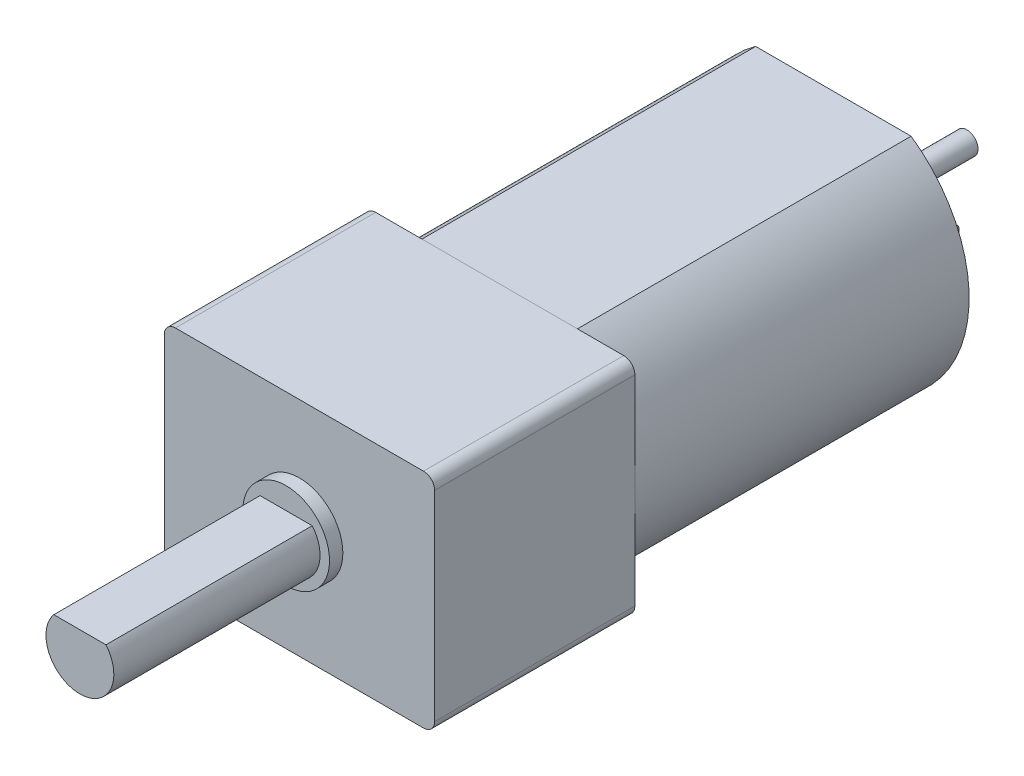
ISO-10303-21;
HEADER;
FILE_DESCRIPTION(('STEP AP214'),'2;1');
FILE_NAME('part.step','',(''),(''),'','','');
FILE_SCHEMA(('AUTOMOTIVE_DESIGN { 1 0 10303 214 1 1 1 1 }'));
ENDSEC;
DATA;
#1=APPLICATION_CONTEXT('core data for automotive mechanical design processes');
#2=APPLICATION_PROTOCOL_DEFINITION('international standard','automotive_design',2000,#1);
#3=PRODUCT_CONTEXT('',#1,'mechanical');
#4=PRODUCT('Part','Part','',(#3));
#5=PRODUCT_RELATED_PRODUCT_CATEGORY('part','',(#4));
#6=PRODUCT_DEFINITION_FORMATION('','',#4);
#7=PRODUCT_DEFINITION_CONTEXT('part definition',#1,'design');
#8=PRODUCT_DEFINITION('design','',#6,#7);
#9=PRODUCT_DEFINITION_SHAPE('','',#8);
#10=(LENGTH_UNIT() NAMED_UNIT(*) SI_UNIT(.MILLI.,.METRE.));
#11=(NAMED_UNIT(*) PLANE_ANGLE_UNIT() SI_UNIT($,.RADIAN.));
#12=(NAMED_UNIT(*) SI_UNIT($,.STERADIAN.) SOLID_ANGLE_UNIT());
#13=UNCERTAINTY_MEASURE_WITH_UNIT(LENGTH_MEASURE(1.E-05),#10,'distance_accuracy_value','');
#14=(GEOMETRIC_REPRESENTATION_CONTEXT(3) GLOBAL_UNCERTAINTY_ASSIGNED_CONTEXT((#13)) GLOBAL_UNIT_ASSIGNED_CONTEXT((#10,
#11,#12)) REPRESENTATION_CONTEXT('',''));
#15=CARTESIAN_POINT('',(0.,0.,0.));
#16=DIRECTION('',(0.,0.,1.));
#17=DIRECTION('',(1.,0.,0.));
#18=AXIS2_PLACEMENT_3D('',#15,#16,#17);
#19=CARTESIAN_POINT('',(0.,0.,-30.));
#20=DIRECTION('',(0.,0.,1.));
#21=DIRECTION('',(1.,0.,0.));
#22=AXIS2_PLACEMENT_3D('',#19,#20,#21);
#23=CYLINDRICAL_SURFACE('',#22,0.5);
#24=CARTESIAN_POINT('',(0.,0.,-30.));
#25=DIRECTION('',(0.,0.,-1.));
#26=DIRECTION('',(-1.,0.,0.));
#27=AXIS2_PLACEMENT_3D('',#24,#25,#26);
#28=CIRCLE('',#27,0.5);
#29=CARTESIAN_POINT('',(-0.5,0.,-30.));
#30=VERTEX_POINT('',#29);
#31=EDGE_CURVE('E11',#30,#30,#28,.T.);
#32=ORIENTED_EDGE('',*,*,#31,.F.);
#33=EDGE_LOOP('',(#32));
#34=FACE_BOUND('',#33,.T.);
#35=CARTESIAN_POINT('',(0.,0.,-25.5));
#36=DIRECTION('',(0.,0.,-1.));
#37=DIRECTION('',(-1.,0.,0.));
#38=AXIS2_PLACEMENT_3D('',#35,#36,#37);
#39=CIRCLE('',#38,0.5);
#40=CARTESIAN_POINT('',(-0.5,0.,-25.5));
#41=VERTEX_POINT('',#40);
#42=EDGE_CURVE('E44',#41,#41,#39,.T.);
#43=ORIENTED_EDGE('',*,*,#42,.T.);
#44=EDGE_LOOP('',(#43));
#45=FACE_BOUND('',#44,.T.);
#46=ADVANCED_FACE('F41',(#34,#45),#23,.T.);
#47=CARTESIAN_POINT('',(0.,0.,-30.));
#48=DIRECTION('',(0.,0.,-1.));
#49=DIRECTION('',(-1.,0.,0.));
#50=AXIS2_PLACEMENT_3D('',#47,#48,#49);
#51=PLANE('',#50);
#52=ORIENTED_EDGE('',*,*,#31,.T.);
#53=EDGE_LOOP('',(#52));
#54=FACE_BOUND('',#53,.T.);
#55=ADVANCED_FACE('F56',(#54),#51,.T.);
#56=CARTESIAN_POINT('',(0.,0.,-25.5));
#57=DIRECTION('',(0.,0.,-1.));
#58=DIRECTION('',(-1.,0.,0.));
#59=AXIS2_PLACEMENT_3D('',#56,#57,#58);
#60=PLANE('',#59);
#61=ORIENTED_EDGE('',*,*,#42,.F.);
#62=EDGE_LOOP('',(#61));
#63=FACE_BOUND('',#62,.T.);
#64=ADVANCED_FACE('F54',(#63),#60,.F.);
#65=CLOSED_SHELL('',(#46,#55,#64));
#66=MANIFOLD_SOLID_BREP('B2',#65);
#67=CARTESIAN_POINT('',(0.,0.,-25.5));
#68=DIRECTION('',(0.,0.,1.));
#69=DIRECTION('',(1.,0.,0.));
#70=AXIS2_PLACEMENT_3D('',#67,#68,#69);
#71=CYLINDRICAL_SURFACE('',#70,2.5);
#72=CARTESIAN_POINT('',(0.,0.,-25.2));
#73=DIRECTION('',(0.,0.,-1.));
#74=DIRECTION('',(-1.,0.,0.));
#75=AXIS2_PLACEMENT_3D('',#72,#73,#74);
#76=CIRCLE('',#75,2.5);
#77=CARTESIAN_POINT('',(-2.5,0.,-25.2));
#78=VERTEX_POINT('',#77);
#79=EDGE_CURVE('E40',#78,#78,#76,.F.);
#80=ORIENTED_EDGE('',*,*,#79,.T.);
#81=EDGE_LOOP('',(#80));
#82=FACE_BOUND('',#81,.T.);
#83=CARTESIAN_POINT('',(0.,0.,-24.));
#84=DIRECTION('',(0.,0.,-1.));
#85=DIRECTION('',(-1.,0.,0.));
#86=AXIS2_PLACEMENT_3D('',#83,#84,#85);
#87=CIRCLE('',#86,2.5);
#88=CARTESIAN_POINT('',(-2.5,0.,-24.));
#89=VERTEX_POINT('',#88);
#90=EDGE_CURVE('E102',#89,#89,#87,.T.);
#91=ORIENTED_EDGE('',*,*,#90,.T.);
#92=EDGE_LOOP('',(#91));
#93=FACE_BOUND('',#92,.T.);
#94=ADVANCED_FACE('F91',(#82,#93),#71,.T.);
#95=CARTESIAN_POINT('',(0.,0.,-25.5));
#96=DIRECTION('',(0.,0.,-1.));
#97=DIRECTION('',(-1.,0.,0.));
#98=AXIS2_PLACEMENT_3D('',#95,#96,#97);
#99=PLANE('',#98);
#100=CARTESIAN_POINT('',(0.,0.,-25.5));
#101=DIRECTION('',(0.,0.,-1.));
#102=DIRECTION('',(-1.,0.,0.));
#103=AXIS2_PLACEMENT_3D('',#100,#101,#102);
#104=CIRCLE('',#103,2.2);
#105=CARTESIAN_POINT('',(-2.2,0.,-25.5));
#106=VERTEX_POINT('',#105);
#107=EDGE_CURVE('E98',#106,#106,#104,.T.);
#108=ORIENTED_EDGE('',*,*,#107,.T.);
#109=EDGE_LOOP('',(#108));
#110=FACE_BOUND('',#109,.T.);
#111=ADVANCED_FACE('F112',(#110),#99,.T.);
#112=CARTESIAN_POINT('',(0.,0.,-24.));
#113=DIRECTION('',(0.,0.,-1.));
#114=DIRECTION('',(-1.,0.,0.));
#115=AXIS2_PLACEMENT_3D('',#112,#113,#114);
#116=PLANE('',#115);
#117=ORIENTED_EDGE('',*,*,#90,.F.);
#118=EDGE_LOOP('',(#117));
#119=FACE_BOUND('',#118,.T.);
#120=ADVANCED_FACE('F110',(#119),#116,.F.);
#121=CARTESIAN_POINT('',(0.,0.,-25.2));
#122=DIRECTION('',(0.,0.,-1.));
#123=DIRECTION('',(-1.,0.,0.));
#124=AXIS2_PLACEMENT_3D('',#121,#122,#123);
#125=TOROIDAL_SURFACE('',#124,2.2,0.3);
#126=ORIENTED_EDGE('',*,*,#79,.F.);
#127=EDGE_LOOP('',(#126));
#128=FACE_BOUND('',#127,.T.);
#129=ORIENTED_EDGE('',*,*,#107,.F.);
#130=EDGE_LOOP('',(#129));
#131=FACE_BOUND('',#130,.T.);
#132=ADVANCED_FACE('F93',(#128,#131),#125,.T.);
#133=CLOSED_SHELL('',(#94,#111,#120,#132));
#134=MANIFOLD_SOLID_BREP('B6',#133);
#135=CARTESIAN_POINT('',(0.,0.,-24.));
#136=DIRECTION('',(0.,0.,-1.));
#137=DIRECTION('',(-1.,0.,0.));
#138=AXIS2_PLACEMENT_3D('',#135,#136,#137);
#139=PLANE('',#138);
#140=DIRECTION('',(0.,-1.,0.));
#141=VECTOR('',#140,1.);
#142=CARTESIAN_POINT('',(3.35,0.75,-24.));
#143=LINE('',#142,#141);
#144=CARTESIAN_POINT('',(3.35,0.75,-24.));
#145=VERTEX_POINT('',#144);
#146=CARTESIAN_POINT('',(3.35,-0.75,-24.));
#147=VERTEX_POINT('',#146);
#148=EDGE_CURVE('E274',#145,#147,#143,.T.);
#149=ORIENTED_EDGE('',*,*,#148,.T.);
#150=DIRECTION('',(1.,0.,0.));
#151=VECTOR('',#150,1.);
#152=CARTESIAN_POINT('',(3.35,-0.75,-24.));
#153=LINE('',#152,#151);
#154=CARTESIAN_POINT('',(3.65,-0.75,-24.));
#155=VERTEX_POINT('',#154);
#156=EDGE_CURVE('E288',#147,#155,#153,.T.);
#157=ORIENTED_EDGE('',*,*,#156,.T.);
#158=DIRECTION('',(0.,1.,0.));
#159=VECTOR('',#158,1.);
#160=CARTESIAN_POINT('',(3.65,0.75,-24.));
#161=LINE('',#160,#159);
#162=CARTESIAN_POINT('',(3.65,0.75,-24.));
#163=VERTEX_POINT('',#162);
#164=EDGE_CURVE('E296',#155,#163,#161,.T.);
#165=ORIENTED_EDGE('',*,*,#164,.T.);
#166=DIRECTION('',(-1.,0.,0.));
#167=VECTOR('',#166,1.);
#168=CARTESIAN_POINT('',(3.35,0.75,-24.));
#169=LINE('',#168,#167);
#170=EDGE_CURVE('E291',#163,#145,#169,.T.);
#171=ORIENTED_EDGE('',*,*,#170,.T.);
#172=EDGE_LOOP('',(#149,#157,#165,#171));
#173=FACE_BOUND('',#172,.T.);
#174=CARTESIAN_POINT('',(0.,0.,-24.));
#175=DIRECTION('',(0.,0.,-1.));
#176=DIRECTION('',(-1.,0.,0.));
#177=AXIS2_PLACEMENT_3D('',#174,#175,#176);
#178=CIRCLE('',#177,6.10000000000001);
#179=CARTESIAN_POINT('',(-3.49428104193124,-5.,-24.));
#180=VERTEX_POINT('',#179);
#181=CARTESIAN_POINT('',(-3.49428104193124,5.,-24.));
#182=VERTEX_POINT('',#181);
#183=EDGE_CURVE('E334',#180,#182,#178,.T.);
#184=ORIENTED_EDGE('',*,*,#183,.T.);
#185=DIRECTION('',(1.,0.,0.));
#186=VECTOR('',#185,1.);
#187=CARTESIAN_POINT('',(3.49428104193124,5.,-24.));
#188=LINE('',#187,#186);
#189=CARTESIAN_POINT('',(3.49428104193124,5.,-24.));
#190=VERTEX_POINT('',#189);
#191=EDGE_CURVE('E337',#182,#190,#188,.T.);
#192=ORIENTED_EDGE('',*,*,#191,.T.);
#193=CARTESIAN_POINT('',(0.,0.,-24.));
#194=DIRECTION('',(0.,0.,-1.));
#195=DIRECTION('',(-1.,0.,0.));
#196=AXIS2_PLACEMENT_3D('',#193,#194,#195);
#197=CIRCLE('',#196,6.10000000000001);
#198=CARTESIAN_POINT('',(3.49428104193125,-5.,-24.));
#199=VERTEX_POINT('',#198);
#200=EDGE_CURVE('E340',#190,#199,#197,.T.);
#201=ORIENTED_EDGE('',*,*,#200,.T.);
#202=DIRECTION('',(-1.,0.,0.));
#203=VECTOR('',#202,1.);
#204=CARTESIAN_POINT('',(3.49428104193124,-5.,-24.));
#205=LINE('',#204,#203);
#206=EDGE_CURVE('E342',#199,#180,#205,.T.);
#207=ORIENTED_EDGE('',*,*,#206,.T.);
#208=EDGE_LOOP('',(#184,#192,#201,#207));
#209=FACE_BOUND('',#208,.T.);
#210=DIRECTION('',(-1.,0.,0.));
#211=VECTOR('',#210,1.);
#212=CARTESIAN_POINT('',(-3.35,-0.75,-24.));
#213=LINE('',#212,#211);
#214=CARTESIAN_POINT('',(-3.35,-0.75,-24.));
#215=VERTEX_POINT('',#214);
#216=CARTESIAN_POINT('',(-3.65,-0.75,-24.));
#217=VERTEX_POINT('',#216);
#218=EDGE_CURVE('E318',#215,#217,#213,.T.);
#219=ORIENTED_EDGE('',*,*,#218,.F.);
#220=DIRECTION('',(0.,-1.,0.));
#221=VECTOR('',#220,1.);
#222=CARTESIAN_POINT('',(-3.35,0.75,-24.));
#223=LINE('',#222,#221);
#224=CARTESIAN_POINT('',(-3.35,0.75,-24.));
#225=VERTEX_POINT('',#224);
#226=EDGE_CURVE('E307',#225,#215,#223,.T.);
#227=ORIENTED_EDGE('',*,*,#226,.F.);
#228=DIRECTION('',(1.,0.,0.));
#229=VECTOR('',#228,1.);
#230=CARTESIAN_POINT('',(-3.35,0.75,-24.));
#231=LINE('',#230,#229);
#232=CARTESIAN_POINT('',(-3.65,0.75,-24.));
#233=VERTEX_POINT('',#232);
#234=EDGE_CURVE('E312',#233,#225,#231,.T.);
#235=ORIENTED_EDGE('',*,*,#234,.F.);
#236=DIRECTION('',(0.,1.,0.));
#237=VECTOR('',#236,1.);
#238=CARTESIAN_POINT('',(-3.65,0.75,-24.));
#239=LINE('',#238,#237);
#240=EDGE_CURVE('E321',#217,#233,#239,.T.);
#241=ORIENTED_EDGE('',*,*,#240,.F.);
#242=EDGE_LOOP('',(#219,#227,#235,#241));
#243=FACE_BOUND('',#242,.T.);
#244=ADVANCED_FACE('F155',(#173,#209,#243),#139,.T.);
#245=CARTESIAN_POINT('',(0.,0.,-24.));
#246=DIRECTION('',(0.,0.,1.));
#247=DIRECTION('',(1.,0.,0.));
#248=AXIS2_PLACEMENT_3D('',#245,#246,#247);
#249=CYLINDRICAL_SURFACE('',#248,6.10000000000001);
#250=CARTESIAN_POINT('',(0.,0.,-9.));
#251=DIRECTION('',(0.,0.,-1.));
#252=DIRECTION('',(-1.,0.,0.));
#253=AXIS2_PLACEMENT_3D('',#250,#251,#252);
#254=CIRCLE('',#253,6.10000000000001);
#255=CARTESIAN_POINT('',(-3.49428104193124,-5.,-9.));
#256=VERTEX_POINT('',#255);
#257=CARTESIAN_POINT('',(-3.49428104193124,5.,-9.));
#258=VERTEX_POINT('',#257);
#259=EDGE_CURVE('E333',#256,#258,#254,.T.);
#260=ORIENTED_EDGE('',*,*,#259,.T.);
#261=DIRECTION('',(0.,0.,1.));
#262=VECTOR('',#261,1.);
#263=CARTESIAN_POINT('',(-3.49428104193124,5.,-24.));
#264=LINE('',#263,#262);
#265=EDGE_CURVE('E360',#182,#258,#264,.T.);
#266=ORIENTED_EDGE('',*,*,#265,.F.);
#267=ORIENTED_EDGE('',*,*,#183,.F.);
#268=DIRECTION('',(0.,0.,1.));
#269=VECTOR('',#268,1.);
#270=CARTESIAN_POINT('',(-3.49428104193124,-5.,-24.));
#271=LINE('',#270,#269);
#272=EDGE_CURVE('E344',#180,#256,#271,.T.);
#273=ORIENTED_EDGE('',*,*,#272,.T.);
#274=EDGE_LOOP('',(#260,#266,#267,#273));
#275=FACE_BOUND('',#274,.T.);
#276=ADVANCED_FACE('F409',(#275),#249,.T.);
#277=CARTESIAN_POINT('',(3.49428104193124,5.,-24.));
#278=DIRECTION('',(0.,-1.,0.));
#279=DIRECTION('',(0.,0.,-1.));
#280=AXIS2_PLACEMENT_3D('',#277,#278,#279);
#281=PLANE('',#280);
#282=DIRECTION('',(1.,0.,0.));
#283=VECTOR('',#282,1.);
#284=CARTESIAN_POINT('',(3.49428104193124,5.,-9.));
#285=LINE('',#284,#283);
#286=CARTESIAN_POINT('',(3.49428104193124,5.,-9.));
#287=VERTEX_POINT('',#286);
#288=EDGE_CURVE('E347',#258,#287,#285,.T.);
#289=ORIENTED_EDGE('',*,*,#288,.T.);
#290=DIRECTION('',(0.,0.,1.));
#291=VECTOR('',#290,1.);
#292=CARTESIAN_POINT('',(3.49428104193124,5.,-24.));
#293=LINE('',#292,#291);
#294=EDGE_CURVE('E357',#190,#287,#293,.T.);
#295=ORIENTED_EDGE('',*,*,#294,.F.);
#296=ORIENTED_EDGE('',*,*,#191,.F.);
#297=ORIENTED_EDGE('',*,*,#265,.T.);
#298=EDGE_LOOP('',(#289,#295,#296,#297));
#299=FACE_BOUND('',#298,.T.);
#300=ADVANCED_FACE('F414',(#299),#281,.F.);
#301=CARTESIAN_POINT('',(0.,0.,-24.));
#302=DIRECTION('',(0.,0.,1.));
#303=DIRECTION('',(1.,0.,0.));
#304=AXIS2_PLACEMENT_3D('',#301,#302,#303);
#305=CYLINDRICAL_SURFACE('',#304,6.10000000000001);
#306=CARTESIAN_POINT('',(0.,0.,-9.));
#307=DIRECTION('',(0.,0.,-1.));
#308=DIRECTION('',(-1.,0.,0.));
#309=AXIS2_PLACEMENT_3D('',#306,#307,#308);
#310=CIRCLE('',#309,6.10000000000001);
#311=CARTESIAN_POINT('',(3.49428104193125,-5.,-9.));
#312=VERTEX_POINT('',#311);
#313=EDGE_CURVE('E349',#287,#312,#310,.T.);
#314=ORIENTED_EDGE('',*,*,#313,.T.);
#315=DIRECTION('',(0.,0.,1.));
#316=VECTOR('',#315,1.);
#317=CARTESIAN_POINT('',(3.49428104193125,-5.,-24.));
#318=LINE('',#317,#316);
#319=EDGE_CURVE('E354',#199,#312,#318,.T.);
#320=ORIENTED_EDGE('',*,*,#319,.F.);
#321=ORIENTED_EDGE('',*,*,#200,.F.);
#322=ORIENTED_EDGE('',*,*,#294,.T.);
#323=EDGE_LOOP('',(#314,#320,#321,#322));
#324=FACE_BOUND('',#323,.T.);
#325=ADVANCED_FACE('F428',(#324),#305,.T.);
#326=CARTESIAN_POINT('',(3.49428104193124,-5.,-24.));
#327=DIRECTION('',(0.,1.,0.));
#328=DIRECTION('',(0.,0.,1.));
#329=AXIS2_PLACEMENT_3D('',#326,#327,#328);
#330=PLANE('',#329);
#331=DIRECTION('',(-1.,0.,0.));
#332=VECTOR('',#331,1.);
#333=CARTESIAN_POINT('',(3.49428104193124,-5.,-9.));
#334=LINE('',#333,#332);
#335=EDGE_CURVE('E338',#312,#256,#334,.T.);
#336=ORIENTED_EDGE('',*,*,#335,.T.);
#337=ORIENTED_EDGE('',*,*,#272,.F.);
#338=ORIENTED_EDGE('',*,*,#206,.F.);
#339=ORIENTED_EDGE('',*,*,#319,.T.);
#340=EDGE_LOOP('',(#336,#337,#338,#339));
#341=FACE_BOUND('',#340,.T.);
#342=ADVANCED_FACE('F424',(#341),#330,.F.);
#343=CARTESIAN_POINT('',(0.,0.,-9.));
#344=DIRECTION('',(0.,0.,-1.));
#345=DIRECTION('',(-1.,0.,0.));
#346=AXIS2_PLACEMENT_3D('',#343,#344,#345);
#347=PLANE('',#346);
#348=ORIENTED_EDGE('',*,*,#259,.F.);
#349=ORIENTED_EDGE('',*,*,#335,.F.);
#350=ORIENTED_EDGE('',*,*,#313,.F.);
#351=ORIENTED_EDGE('',*,*,#288,.F.);
#352=EDGE_LOOP('',(#348,#349,#350,#351));
#353=FACE_BOUND('',#352,.T.);
#354=ADVANCED_FACE('F421',(#353),#347,.F.);
#355=CARTESIAN_POINT('',(-3.35,0.75,-26.));
#356=DIRECTION('',(-1.,0.,0.));
#357=DIRECTION('',(0.,0.,1.));
#358=AXIS2_PLACEMENT_3D('',#355,#356,#357);
#359=PLANE('',#358);
#360=DIRECTION('',(0.,0.,1.));
#361=VECTOR('',#360,1.);
#362=CARTESIAN_POINT('',(-3.35,-0.75,-26.));
#363=LINE('',#362,#361);
#364=CARTESIAN_POINT('',(-3.35,-0.75,-25.7));
#365=VERTEX_POINT('',#364);
#366=EDGE_CURVE('E331',#365,#215,#363,.T.);
#367=ORIENTED_EDGE('',*,*,#366,.F.);
#368=CARTESIAN_POINT('',(-3.35,-0.45,-25.7));
#369=DIRECTION('',(-1.,0.,0.));
#370=DIRECTION('',(0.,0.,1.));
#371=AXIS2_PLACEMENT_3D('',#368,#369,#370);
#372=CIRCLE('',#371,0.3);
#373=CARTESIAN_POINT('',(-3.35,-0.45,-26.));
#374=VERTEX_POINT('',#373);
#375=EDGE_CURVE('E377',#365,#374,#372,.F.);
#376=ORIENTED_EDGE('',*,*,#375,.T.);
#377=DIRECTION('',(0.,-1.,0.));
#378=VECTOR('',#377,1.);
#379=CARTESIAN_POINT('',(-3.35,0.75,-26.));
#380=LINE('',#379,#378);
#381=CARTESIAN_POINT('',(-3.35,0.45,-26.));
#382=VERTEX_POINT('',#381);
#383=EDGE_CURVE('E308',#382,#374,#380,.T.);
#384=ORIENTED_EDGE('',*,*,#383,.F.);
#385=CARTESIAN_POINT('',(-3.35,0.45,-25.7));
#386=DIRECTION('',(-1.,0.,0.));
#387=DIRECTION('',(0.,0.,1.));
#388=AXIS2_PLACEMENT_3D('',#385,#386,#387);
#389=CIRCLE('',#388,0.3);
#390=CARTESIAN_POINT('',(-3.35,0.75,-25.7));
#391=VERTEX_POINT('',#390);
#392=EDGE_CURVE('E375',#382,#391,#389,.F.);
#393=ORIENTED_EDGE('',*,*,#392,.T.);
#394=DIRECTION('',(0.,0.,1.));
#395=VECTOR('',#394,1.);
#396=CARTESIAN_POINT('',(-3.35,0.75,-26.));
#397=LINE('',#396,#395);
#398=EDGE_CURVE('E315',#391,#225,#397,.T.);
#399=ORIENTED_EDGE('',*,*,#398,.T.);
#400=ORIENTED_EDGE('',*,*,#226,.T.);
#401=EDGE_LOOP('',(#367,#376,#384,#393,#399,#400));
#402=FACE_BOUND('',#401,.T.);
#403=ADVANCED_FACE('F419',(#402),#359,.F.);
#404=CARTESIAN_POINT('',(-3.35,-0.75,-26.));
#405=DIRECTION('',(0.,1.,0.));
#406=DIRECTION('',(-1.,0.,0.));
#407=AXIS2_PLACEMENT_3D('',#404,#405,#406);
#408=PLANE('',#407);
#409=DIRECTION('',(0.,0.,1.));
#410=VECTOR('',#409,1.);
#411=CARTESIAN_POINT('',(-3.65,-0.75,-26.));
#412=LINE('',#411,#410);
#413=CARTESIAN_POINT('',(-3.65,-0.75,-25.7));
#414=VERTEX_POINT('',#413);
#415=EDGE_CURVE('E329',#414,#217,#412,.T.);
#416=ORIENTED_EDGE('',*,*,#415,.F.);
#417=DIRECTION('',(-1.,0.,0.));
#418=VECTOR('',#417,1.);
#419=CARTESIAN_POINT('',(-3.35,-0.75,-25.7));
#420=LINE('',#419,#418);
#421=EDGE_CURVE('E373',#414,#365,#420,.F.);
#422=ORIENTED_EDGE('',*,*,#421,.T.);
#423=ORIENTED_EDGE('',*,*,#366,.T.);
#424=ORIENTED_EDGE('',*,*,#218,.T.);
#425=EDGE_LOOP('',(#416,#422,#423,#424));
#426=FACE_BOUND('',#425,.T.);
#427=ADVANCED_FACE('F537',(#426),#408,.F.);
#428=CARTESIAN_POINT('',(-3.65,0.75,-26.));
#429=DIRECTION('',(1.,0.,0.));
#430=DIRECTION('',(0.,0.,-1.));
#431=AXIS2_PLACEMENT_3D('',#428,#429,#430);
#432=PLANE('',#431);
#433=DIRECTION('',(0.,1.,0.));
#434=VECTOR('',#433,1.);
#435=CARTESIAN_POINT('',(-3.65,0.75,-26.));
#436=LINE('',#435,#434);
#437=CARTESIAN_POINT('',(-3.65,-0.45,-26.));
#438=VERTEX_POINT('',#437);
#439=CARTESIAN_POINT('',(-3.65,0.45,-26.));
#440=VERTEX_POINT('',#439);
#441=EDGE_CURVE('E311',#438,#440,#436,.T.);
#442=ORIENTED_EDGE('',*,*,#441,.F.);
#443=CARTESIAN_POINT('',(-3.65,-0.45,-25.7));
#444=DIRECTION('',(1.,0.,0.));
#445=DIRECTION('',(0.,0.,-1.));
#446=AXIS2_PLACEMENT_3D('',#443,#444,#445);
#447=CIRCLE('',#446,0.3);
#448=EDGE_CURVE('E371',#438,#414,#447,.F.);
#449=ORIENTED_EDGE('',*,*,#448,.T.);
#450=ORIENTED_EDGE('',*,*,#415,.T.);
#451=ORIENTED_EDGE('',*,*,#240,.T.);
#452=DIRECTION('',(0.,0.,1.));
#453=VECTOR('',#452,1.);
#454=CARTESIAN_POINT('',(-3.65,0.75,-26.));
#455=LINE('',#454,#453);
#456=CARTESIAN_POINT('',(-3.65,0.75,-25.7));
#457=VERTEX_POINT('',#456);
#458=EDGE_CURVE('E327',#457,#233,#455,.T.);
#459=ORIENTED_EDGE('',*,*,#458,.F.);
#460=CARTESIAN_POINT('',(-3.65,0.45,-25.7));
#461=DIRECTION('',(1.,0.,0.));
#462=DIRECTION('',(0.,0.,-1.));
#463=AXIS2_PLACEMENT_3D('',#460,#461,#462);
#464=CIRCLE('',#463,0.3);
#465=EDGE_CURVE('E369',#457,#440,#464,.F.);
#466=ORIENTED_EDGE('',*,*,#465,.T.);
#467=EDGE_LOOP('',(#442,#449,#450,#451,#459,#466));
#468=FACE_BOUND('',#467,.T.);
#469=ADVANCED_FACE('F528',(#468),#432,.F.);
#470=CARTESIAN_POINT('',(-3.35,0.75,-26.));
#471=DIRECTION('',(0.,-1.,0.));
#472=DIRECTION('',(1.,0.,0.));
#473=AXIS2_PLACEMENT_3D('',#470,#471,#472);
#474=PLANE('',#473);
#475=ORIENTED_EDGE('',*,*,#398,.F.);
#476=DIRECTION('',(1.,0.,0.));
#477=VECTOR('',#476,1.);
#478=CARTESIAN_POINT('',(-3.65,0.75,-25.7));
#479=LINE('',#478,#477);
#480=EDGE_CURVE('E379',#391,#457,#479,.F.);
#481=ORIENTED_EDGE('',*,*,#480,.T.);
#482=ORIENTED_EDGE('',*,*,#458,.T.);
#483=ORIENTED_EDGE('',*,*,#234,.T.);
#484=EDGE_LOOP('',(#475,#481,#482,#483));
#485=FACE_BOUND('',#484,.T.);
#486=ADVANCED_FACE('F519',(#485),#474,.F.);
#487=CARTESIAN_POINT('',(-3.35,-0.75,-26.));
#488=DIRECTION('',(0.,0.,-1.));
#489=DIRECTION('',(-1.,0.,0.));
#490=AXIS2_PLACEMENT_3D('',#487,#488,#489);
#491=PLANE('',#490);
#492=ORIENTED_EDGE('',*,*,#383,.T.);
#493=DIRECTION('',(-1.,0.,0.));
#494=VECTOR('',#493,1.);
#495=CARTESIAN_POINT('',(-3.65,-0.45,-26.));
#496=LINE('',#495,#494);
#497=EDGE_CURVE('E366',#374,#438,#496,.T.);
#498=ORIENTED_EDGE('',*,*,#497,.T.);
#499=ORIENTED_EDGE('',*,*,#441,.T.);
#500=DIRECTION('',(1.,0.,0.));
#501=VECTOR('',#500,1.);
#502=CARTESIAN_POINT('',(-3.35,0.45,-26.));
#503=LINE('',#502,#501);
#504=EDGE_CURVE('E363',#440,#382,#503,.T.);
#505=ORIENTED_EDGE('',*,*,#504,.T.);
#506=EDGE_LOOP('',(#492,#498,#499,#505));
#507=FACE_BOUND('',#506,.T.);
#508=ADVANCED_FACE('F439',(#507),#491,.T.);
#509=CARTESIAN_POINT('',(-3.35,-0.45,-25.7));
#510=DIRECTION('',(1.,0.,0.));
#511=DIRECTION('',(0.,1.,0.));
#512=AXIS2_PLACEMENT_3D('',#509,#510,#511);
#513=CYLINDRICAL_SURFACE('',#512,0.3);
#514=ORIENTED_EDGE('',*,*,#375,.F.);
#515=ORIENTED_EDGE('',*,*,#421,.F.);
#516=ORIENTED_EDGE('',*,*,#448,.F.);
#517=ORIENTED_EDGE('',*,*,#497,.F.);
#518=EDGE_LOOP('',(#514,#515,#516,#517));
#519=FACE_BOUND('',#518,.T.);
#520=ADVANCED_FACE('F436',(#519),#513,.T.);
#521=CARTESIAN_POINT('',(-3.35,0.45,-25.7));
#522=DIRECTION('',(-1.,0.,0.));
#523=DIRECTION('',(0.,-1.,0.));
#524=AXIS2_PLACEMENT_3D('',#521,#522,#523);
#525=CYLINDRICAL_SURFACE('',#524,0.3);
#526=ORIENTED_EDGE('',*,*,#465,.F.);
#527=ORIENTED_EDGE('',*,*,#480,.F.);
#528=ORIENTED_EDGE('',*,*,#392,.F.);
#529=ORIENTED_EDGE('',*,*,#504,.F.);
#530=EDGE_LOOP('',(#526,#527,#528,#529));
#531=FACE_BOUND('',#530,.T.);
#532=ADVANCED_FACE('F406',(#531),#525,.T.);
#533=CARTESIAN_POINT('',(3.35,0.75,-26.));
#534=DIRECTION('',(-1.,0.,0.));
#535=DIRECTION('',(0.,0.,1.));
#536=AXIS2_PLACEMENT_3D('',#533,#534,#535);
#537=PLANE('',#536);
#538=DIRECTION('',(0.,-1.,0.));
#539=VECTOR('',#538,1.);
#540=CARTESIAN_POINT('',(3.35,0.75,-26.));
#541=LINE('',#540,#539);
#542=CARTESIAN_POINT('',(3.35,0.45,-26.));
#543=VERTEX_POINT('',#542);
#544=CARTESIAN_POINT('',(3.35,-0.45,-26.));
#545=VERTEX_POINT('',#544);
#546=EDGE_CURVE('E295',#543,#545,#541,.T.);
#547=ORIENTED_EDGE('',*,*,#546,.T.);
#548=CARTESIAN_POINT('',(3.35,-0.45,-25.7));
#549=DIRECTION('',(-1.,0.,0.));
#550=DIRECTION('',(0.,0.,1.));
#551=AXIS2_PLACEMENT_3D('',#548,#549,#550);
#552=CIRCLE('',#551,0.3);
#553=CARTESIAN_POINT('',(3.35,-0.75,-25.7));
#554=VERTEX_POINT('',#553);
#555=EDGE_CURVE('E163',#545,#554,#552,.T.);
#556=ORIENTED_EDGE('',*,*,#555,.T.);
#557=DIRECTION('',(0.,0.,1.));
#558=VECTOR('',#557,1.);
#559=CARTESIAN_POINT('',(3.35,-0.75,-26.));
#560=LINE('',#559,#558);
#561=EDGE_CURVE('E270',#554,#147,#560,.T.);
#562=ORIENTED_EDGE('',*,*,#561,.T.);
#563=ORIENTED_EDGE('',*,*,#148,.F.);
#564=DIRECTION('',(0.,0.,1.));
#565=VECTOR('',#564,1.);
#566=CARTESIAN_POINT('',(3.35,0.75,-26.));
#567=LINE('',#566,#565);
#568=CARTESIAN_POINT('',(3.35,0.75,-25.7));
#569=VERTEX_POINT('',#568);
#570=EDGE_CURVE('E305',#569,#145,#567,.T.);
#571=ORIENTED_EDGE('',*,*,#570,.F.);
#572=CARTESIAN_POINT('',(3.35,0.45,-25.7));
#573=DIRECTION('',(-1.,0.,0.));
#574=DIRECTION('',(0.,0.,1.));
#575=AXIS2_PLACEMENT_3D('',#572,#573,#574);
#576=CIRCLE('',#575,0.3);
#577=EDGE_CURVE('E170',#569,#543,#576,.T.);
#578=ORIENTED_EDGE('',*,*,#577,.T.);
#579=EDGE_LOOP('',(#547,#556,#562,#563,#571,#578));
#580=FACE_BOUND('',#579,.T.);
#581=ADVANCED_FACE('F272',(#580),#537,.T.);
#582=CARTESIAN_POINT('',(3.35,0.75,-26.));
#583=DIRECTION('',(0.,1.,0.));
#584=DIRECTION('',(-1.,0.,0.));
#585=AXIS2_PLACEMENT_3D('',#582,#583,#584);
#586=PLANE('',#585);
#587=DIRECTION('',(0.,0.,1.));
#588=VECTOR('',#587,1.);
#589=CARTESIAN_POINT('',(3.65,0.75,-26.));
#590=LINE('',#589,#588);
#591=CARTESIAN_POINT('',(3.65,0.75,-25.7));
#592=VERTEX_POINT('',#591);
#593=EDGE_CURVE('E303',#592,#163,#590,.T.);
#594=ORIENTED_EDGE('',*,*,#593,.F.);
#595=DIRECTION('',(-1.,0.,0.));
#596=VECTOR('',#595,1.);
#597=CARTESIAN_POINT('',(3.35,0.75,-25.7));
#598=LINE('',#597,#596);
#599=EDGE_CURVE('E89',#592,#569,#598,.T.);
#600=ORIENTED_EDGE('',*,*,#599,.T.);
#601=ORIENTED_EDGE('',*,*,#570,.T.);
#602=ORIENTED_EDGE('',*,*,#170,.F.);
#603=EDGE_LOOP('',(#594,#600,#601,#602));
#604=FACE_BOUND('',#603,.T.);
#605=ADVANCED_FACE('F397',(#604),#586,.T.);
#606=CARTESIAN_POINT('',(3.65,0.75,-26.));
#607=DIRECTION('',(1.,0.,0.));
#608=DIRECTION('',(0.,0.,-1.));
#609=AXIS2_PLACEMENT_3D('',#606,#607,#608);
#610=PLANE('',#609);
#611=DIRECTION('',(0.,0.,1.));
#612=VECTOR('',#611,1.);
#613=CARTESIAN_POINT('',(3.65,-0.75,-26.));
#614=LINE('',#613,#612);
#615=CARTESIAN_POINT('',(3.65,-0.75,-25.7));
#616=VERTEX_POINT('',#615);
#617=EDGE_CURVE('E280',#616,#155,#614,.T.);
#618=ORIENTED_EDGE('',*,*,#617,.F.);
#619=CARTESIAN_POINT('',(3.65,-0.45,-25.7));
#620=DIRECTION('',(1.,0.,0.));
#621=DIRECTION('',(0.,0.,-1.));
#622=AXIS2_PLACEMENT_3D('',#619,#620,#621);
#623=CIRCLE('',#622,0.3);
#624=CARTESIAN_POINT('',(3.65,-0.45,-26.));
#625=VERTEX_POINT('',#624);
#626=EDGE_CURVE('E385',#616,#625,#623,.T.);
#627=ORIENTED_EDGE('',*,*,#626,.T.);
#628=DIRECTION('',(0.,1.,0.));
#629=VECTOR('',#628,1.);
#630=CARTESIAN_POINT('',(3.65,0.75,-26.));
#631=LINE('',#630,#629);
#632=CARTESIAN_POINT('',(3.65,0.45,-26.));
#633=VERTEX_POINT('',#632);
#634=EDGE_CURVE('E281',#625,#633,#631,.T.);
#635=ORIENTED_EDGE('',*,*,#634,.T.);
#636=CARTESIAN_POINT('',(3.65,0.45,-25.7));
#637=DIRECTION('',(1.,0.,0.));
#638=DIRECTION('',(0.,0.,-1.));
#639=AXIS2_PLACEMENT_3D('',#636,#637,#638);
#640=CIRCLE('',#639,0.3);
#641=EDGE_CURVE('E383',#633,#592,#640,.T.);
#642=ORIENTED_EDGE('',*,*,#641,.T.);
#643=ORIENTED_EDGE('',*,*,#593,.T.);
#644=ORIENTED_EDGE('',*,*,#164,.F.);
#645=EDGE_LOOP('',(#618,#627,#635,#642,#643,#644));
#646=FACE_BOUND('',#645,.T.);
#647=ADVANCED_FACE('F395',(#646),#610,.T.);
#648=CARTESIAN_POINT('',(3.35,-0.75,-26.));
#649=DIRECTION('',(0.,-1.,0.));
#650=DIRECTION('',(1.,0.,0.));
#651=AXIS2_PLACEMENT_3D('',#648,#649,#650);
#652=PLANE('',#651);
#653=ORIENTED_EDGE('',*,*,#561,.F.);
#654=DIRECTION('',(1.,0.,0.));
#655=VECTOR('',#654,1.);
#656=CARTESIAN_POINT('',(3.35,-0.75,-25.7));
#657=LINE('',#656,#655);
#658=EDGE_CURVE('E381',#554,#616,#657,.T.);
#659=ORIENTED_EDGE('',*,*,#658,.T.);
#660=ORIENTED_EDGE('',*,*,#617,.T.);
#661=ORIENTED_EDGE('',*,*,#156,.F.);
#662=EDGE_LOOP('',(#653,#659,#660,#661));
#663=FACE_BOUND('',#662,.T.);
#664=ADVANCED_FACE('F293',(#663),#652,.T.);
#665=CARTESIAN_POINT('',(3.35,-0.75,-26.));
#666=DIRECTION('',(0.,0.,-1.));
#667=DIRECTION('',(1.,0.,0.));
#668=AXIS2_PLACEMENT_3D('',#665,#666,#667);
#669=PLANE('',#668);
#670=ORIENTED_EDGE('',*,*,#634,.F.);
#671=DIRECTION('',(1.,0.,0.));
#672=VECTOR('',#671,1.);
#673=CARTESIAN_POINT('',(3.35,-0.45,-26.));
#674=LINE('',#673,#672);
#675=EDGE_CURVE('E177',#625,#545,#674,.F.);
#676=ORIENTED_EDGE('',*,*,#675,.T.);
#677=ORIENTED_EDGE('',*,*,#546,.F.);
#678=DIRECTION('',(-1.,0.,0.));
#679=VECTOR('',#678,1.);
#680=CARTESIAN_POINT('',(3.35,0.45,-26.));
#681=LINE('',#680,#679);
#682=EDGE_CURVE('E387',#543,#633,#681,.F.);
#683=ORIENTED_EDGE('',*,*,#682,.T.);
#684=EDGE_LOOP('',(#670,#676,#677,#683));
#685=FACE_BOUND('',#684,.T.);
#686=ADVANCED_FACE('F390',(#685),#669,.T.);
#687=CARTESIAN_POINT('',(3.35,-0.45,-25.7));
#688=DIRECTION('',(1.,0.,0.));
#689=DIRECTION('',(0.,1.,0.));
#690=AXIS2_PLACEMENT_3D('',#687,#688,#689);
#691=CYLINDRICAL_SURFACE('',#690,0.3);
#692=ORIENTED_EDGE('',*,*,#555,.F.);
#693=ORIENTED_EDGE('',*,*,#675,.F.);
#694=ORIENTED_EDGE('',*,*,#626,.F.);
#695=ORIENTED_EDGE('',*,*,#658,.F.);
#696=EDGE_LOOP('',(#692,#693,#694,#695));
#697=FACE_BOUND('',#696,.T.);
#698=ADVANCED_FACE('F443',(#697),#691,.T.);
#699=CARTESIAN_POINT('',(3.35,0.45,-25.7));
#700=DIRECTION('',(-1.,0.,0.));
#701=DIRECTION('',(0.,-1.,0.));
#702=AXIS2_PLACEMENT_3D('',#699,#700,#701);
#703=CYLINDRICAL_SURFACE('',#702,0.3);
#704=ORIENTED_EDGE('',*,*,#641,.F.);
#705=ORIENTED_EDGE('',*,*,#682,.F.);
#706=ORIENTED_EDGE('',*,*,#577,.F.);
#707=ORIENTED_EDGE('',*,*,#599,.F.);
#708=EDGE_LOOP('',(#704,#705,#706,#707));
#709=FACE_BOUND('',#708,.T.);
#710=ADVANCED_FACE('F157',(#709),#703,.T.);
#711=CLOSED_SHELL('',(#244,#276,#300,#325,#342,#354,#403,#427,#469,#486,#508,#520,#532,#581,
#605,#647,#664,#686,#698,#710));
#712=MANIFOLD_SOLID_BREP('B35',#711);
#713=CARTESIAN_POINT('',(0.,0.,0.6));
#714=DIRECTION('',(0.,0.,1.));
#715=DIRECTION('',(1.,0.,0.));
#716=AXIS2_PLACEMENT_3D('',#713,#714,#715);
#717=PLANE('',#716);
#718=CARTESIAN_POINT('',(0.,0.,0.6));
#719=DIRECTION('',(0.,0.,1.));
#720=DIRECTION('',(1.,0.,0.));
#721=AXIS2_PLACEMENT_3D('',#718,#719,#720);
#722=CIRCLE('',#721,1.95);
#723=CARTESIAN_POINT('',(1.95,0.,0.6));
#724=VERTEX_POINT('',#723);
#725=EDGE_CURVE('E726',#724,#724,#722,.T.);
#726=ORIENTED_EDGE('',*,*,#725,.T.);
#727=EDGE_LOOP('',(#726));
#728=FACE_BOUND('',#727,.T.);
#729=DIRECTION('',(-1.,0.,0.));
#730=VECTOR('',#729,1.);
#731=CARTESIAN_POINT('',(-1.17260393995586,0.975000000000002,0.6));
#732=LINE('',#731,#730);
#733=CARTESIAN_POINT('',(1.17260393995586,0.975000000000002,0.6));
#734=VERTEX_POINT('',#733);
#735=CARTESIAN_POINT('',(-1.17260393995586,0.975000000000002,0.6));
#736=VERTEX_POINT('',#735);
#737=EDGE_CURVE('E718',#734,#736,#732,.T.);
#738=ORIENTED_EDGE('',*,*,#737,.F.);
#739=CARTESIAN_POINT('',(0.,0.,0.6));
#740=DIRECTION('',(0.,0.,1.));
#741=DIRECTION('',(1.,0.,0.));
#742=AXIS2_PLACEMENT_3D('',#739,#740,#741);
#743=CIRCLE('',#742,1.525);
#744=EDGE_CURVE('E722',#736,#734,#743,.T.);
#745=ORIENTED_EDGE('',*,*,#744,.F.);
#746=EDGE_LOOP('',(#738,#745));
#747=FACE_BOUND('',#746,.T.);
#748=ADVANCED_FACE('F626',(#728,#747),#717,.T.);
#749=CARTESIAN_POINT('',(-6.075,-5.,0.));
#750=DIRECTION('',(0.,0.,1.));
#751=DIRECTION('',(1.,0.,0.));
#752=AXIS2_PLACEMENT_3D('',#749,#750,#751);
#753=PLANE('',#752);
#754=DIRECTION('',(1.,0.,0.));
#755=VECTOR('',#754,1.);
#756=CARTESIAN_POINT('',(-6.075,-5.,0.));
#757=LINE('',#756,#755);
#758=CARTESIAN_POINT('',(-5.575,-5.,0.));
#759=VERTEX_POINT('',#758);
#760=CARTESIAN_POINT('',(5.575,-5.,0.));
#761=VERTEX_POINT('',#760);
#762=EDGE_CURVE('E749',#759,#761,#757,.T.);
#763=ORIENTED_EDGE('',*,*,#762,.T.);
#764=CARTESIAN_POINT('',(5.575,-4.5,0.));
#765=DIRECTION('',(0.,0.,1.));
#766=DIRECTION('',(1.,0.,0.));
#767=AXIS2_PLACEMENT_3D('',#764,#765,#766);
#768=CIRCLE('',#767,0.5);
#769=CARTESIAN_POINT('',(6.075,-4.5,0.));
#770=VERTEX_POINT('',#769);
#771=EDGE_CURVE('E767',#761,#770,#768,.T.);
#772=ORIENTED_EDGE('',*,*,#771,.T.);
#773=DIRECTION('',(0.,1.,0.));
#774=VECTOR('',#773,1.);
#775=CARTESIAN_POINT('',(6.075,5.,0.));
#776=LINE('',#775,#774);
#777=CARTESIAN_POINT('',(6.075,4.5,0.));
#778=VERTEX_POINT('',#777);
#779=EDGE_CURVE('E752',#770,#778,#776,.T.);
#780=ORIENTED_EDGE('',*,*,#779,.T.);
#781=CARTESIAN_POINT('',(5.575,4.5,0.));
#782=DIRECTION('',(0.,0.,1.));
#783=DIRECTION('',(1.,0.,0.));
#784=AXIS2_PLACEMENT_3D('',#781,#782,#783);
#785=CIRCLE('',#784,0.5);
#786=CARTESIAN_POINT('',(5.575,5.,0.));
#787=VERTEX_POINT('',#786);
#788=EDGE_CURVE('E761',#778,#787,#785,.T.);
#789=ORIENTED_EDGE('',*,*,#788,.T.);
#790=DIRECTION('',(-1.,0.,0.));
#791=VECTOR('',#790,1.);
#792=CARTESIAN_POINT('',(-6.075,5.,0.));
#793=LINE('',#792,#791);
#794=CARTESIAN_POINT('',(-5.575,5.,0.));
#795=VERTEX_POINT('',#794);
#796=EDGE_CURVE('E738',#787,#795,#793,.T.);
#797=ORIENTED_EDGE('',*,*,#796,.T.);
#798=CARTESIAN_POINT('',(-5.575,4.5,0.));
#799=DIRECTION('',(0.,0.,1.));
#800=DIRECTION('',(1.,0.,0.));
#801=AXIS2_PLACEMENT_3D('',#798,#799,#800);
#802=CIRCLE('',#801,0.5);
#803=CARTESIAN_POINT('',(-6.075,4.5,0.));
#804=VERTEX_POINT('',#803);
#805=EDGE_CURVE('E763',#795,#804,#802,.T.);
#806=ORIENTED_EDGE('',*,*,#805,.T.);
#807=DIRECTION('',(0.,-1.,0.));
#808=VECTOR('',#807,1.);
#809=CARTESIAN_POINT('',(-6.075,5.,0.));
#810=LINE('',#809,#808);
#811=CARTESIAN_POINT('',(-6.075,-4.5,0.));
#812=VERTEX_POINT('',#811);
#813=EDGE_CURVE('E732',#804,#812,#810,.T.);
#814=ORIENTED_EDGE('',*,*,#813,.T.);
#815=CARTESIAN_POINT('',(-5.575,-4.5,0.));
#816=DIRECTION('',(0.,0.,1.));
#817=DIRECTION('',(1.,0.,0.));
#818=AXIS2_PLACEMENT_3D('',#815,#816,#817);
#819=CIRCLE('',#818,0.5);
#820=EDGE_CURVE('E765',#812,#759,#819,.T.);
#821=ORIENTED_EDGE('',*,*,#820,.T.);
#822=EDGE_LOOP('',(#763,#772,#780,#789,#797,#806,#814,#821));
#823=FACE_BOUND('',#822,.T.);
#824=CARTESIAN_POINT('',(0.,0.,0.));
#825=DIRECTION('',(0.,0.,1.));
#826=DIRECTION('',(1.,0.,0.));
#827=AXIS2_PLACEMENT_3D('',#824,#825,#826);
#828=CIRCLE('',#827,1.95);
#829=CARTESIAN_POINT('',(1.95,0.,0.));
#830=VERTEX_POINT('',#829);
#831=EDGE_CURVE('E723',#830,#830,#828,.T.);
#832=ORIENTED_EDGE('',*,*,#831,.F.);
#833=EDGE_LOOP('',(#832));
#834=FACE_BOUND('',#833,.T.);
#835=ADVANCED_FACE('F793',(#823,#834),#753,.T.);
#836=CARTESIAN_POINT('',(-6.075,5.,-9.));
#837=DIRECTION('',(-1.,0.,0.));
#838=DIRECTION('',(0.,0.,1.));
#839=AXIS2_PLACEMENT_3D('',#836,#837,#838);
#840=PLANE('',#839);
#841=DIRECTION('',(0.,-1.,0.));
#842=VECTOR('',#841,1.);
#843=CARTESIAN_POINT('',(-6.075,5.,-9.));
#844=LINE('',#843,#842);
#845=CARTESIAN_POINT('',(-6.075,4.5,-9.));
#846=VERTEX_POINT('',#845);
#847=CARTESIAN_POINT('',(-6.075,-4.5,-9.));
#848=VERTEX_POINT('',#847);
#849=EDGE_CURVE('E734',#846,#848,#844,.T.);
#850=ORIENTED_EDGE('',*,*,#849,.T.);
#851=DIRECTION('',(0.,0.,1.));
#852=VECTOR('',#851,1.);
#853=CARTESIAN_POINT('',(-6.075,-4.5,-9.));
#854=LINE('',#853,#852);
#855=EDGE_CURVE('E783',#848,#812,#854,.T.);
#856=ORIENTED_EDGE('',*,*,#855,.T.);
#857=ORIENTED_EDGE('',*,*,#813,.F.);
#858=DIRECTION('',(0.,0.,1.));
#859=VECTOR('',#858,1.);
#860=CARTESIAN_POINT('',(-6.075,4.5,-9.));
#861=LINE('',#860,#859);
#862=EDGE_CURVE('E781',#804,#846,#861,.F.);
#863=ORIENTED_EDGE('',*,*,#862,.T.);
#864=EDGE_LOOP('',(#850,#856,#857,#863));
#865=FACE_BOUND('',#864,.T.);
#866=ADVANCED_FACE('F788',(#865),#840,.T.);
#867=CARTESIAN_POINT('',(-6.075,5.,-9.));
#868=DIRECTION('',(0.,1.,0.));
#869=DIRECTION('',(0.,0.,1.));
#870=AXIS2_PLACEMENT_3D('',#867,#868,#869);
#871=PLANE('',#870);
#872=DIRECTION('',(-1.,0.,0.));
#873=VECTOR('',#872,1.);
#874=CARTESIAN_POINT('',(-6.075,5.,-9.));
#875=LINE('',#874,#873);
#876=CARTESIAN_POINT('',(5.575,5.,-9.));
#877=VERTEX_POINT('',#876);
#878=CARTESIAN_POINT('',(-5.575,5.,-9.));
#879=VERTEX_POINT('',#878);
#880=EDGE_CURVE('E744',#877,#879,#875,.T.);
#881=ORIENTED_EDGE('',*,*,#880,.T.);
#882=DIRECTION('',(0.,0.,1.));
#883=VECTOR('',#882,1.);
#884=CARTESIAN_POINT('',(-5.575,5.,-9.));
#885=LINE('',#884,#883);
#886=EDGE_CURVE('E153',#879,#795,#885,.T.);
#887=ORIENTED_EDGE('',*,*,#886,.T.);
#888=ORIENTED_EDGE('',*,*,#796,.F.);
#889=DIRECTION('',(0.,0.,1.));
#890=VECTOR('',#889,1.);
#891=CARTESIAN_POINT('',(5.575,5.,-9.));
#892=LINE('',#891,#890);
#893=EDGE_CURVE('E634',#787,#877,#892,.F.);
#894=ORIENTED_EDGE('',*,*,#893,.T.);
#895=EDGE_LOOP('',(#881,#887,#888,#894));
#896=FACE_BOUND('',#895,.T.);
#897=ADVANCED_FACE('F799',(#896),#871,.T.);
#898=CARTESIAN_POINT('',(6.075,5.,-9.));
#899=DIRECTION('',(1.,0.,0.));
#900=DIRECTION('',(0.,0.,-1.));
#901=AXIS2_PLACEMENT_3D('',#898,#899,#900);
#902=PLANE('',#901);
#903=ORIENTED_EDGE('',*,*,#779,.F.);
#904=DIRECTION('',(0.,0.,1.));
#905=VECTOR('',#904,1.);
#906=CARTESIAN_POINT('',(6.075,-4.5,-9.));
#907=LINE('',#906,#905);
#908=CARTESIAN_POINT('',(6.075,-4.5,-9.));
#909=VERTEX_POINT('',#908);
#910=EDGE_CURVE('E772',#770,#909,#907,.F.);
#911=ORIENTED_EDGE('',*,*,#910,.T.);
#912=DIRECTION('',(0.,1.,0.));
#913=VECTOR('',#912,1.);
#914=CARTESIAN_POINT('',(6.075,5.,-9.));
#915=LINE('',#914,#913);
#916=CARTESIAN_POINT('',(6.075,4.5,-9.));
#917=VERTEX_POINT('',#916);
#918=EDGE_CURVE('E741',#909,#917,#915,.T.);
#919=ORIENTED_EDGE('',*,*,#918,.T.);
#920=DIRECTION('',(0.,0.,1.));
#921=VECTOR('',#920,1.);
#922=CARTESIAN_POINT('',(6.075,4.5,-9.));
#923=LINE('',#922,#921);
#924=EDGE_CURVE('E769',#917,#778,#923,.T.);
#925=ORIENTED_EDGE('',*,*,#924,.T.);
#926=EDGE_LOOP('',(#903,#911,#919,#925));
#927=FACE_BOUND('',#926,.T.);
#928=ADVANCED_FACE('F807',(#927),#902,.T.);
#929=CARTESIAN_POINT('',(-6.075,-5.,-9.));
#930=DIRECTION('',(0.,-1.,0.));
#931=DIRECTION('',(0.,0.,-1.));
#932=AXIS2_PLACEMENT_3D('',#929,#930,#931);
#933=PLANE('',#932);
#934=DIRECTION('',(1.,0.,0.));
#935=VECTOR('',#934,1.);
#936=CARTESIAN_POINT('',(-6.075,-5.,-9.));
#937=LINE('',#936,#935);
#938=CARTESIAN_POINT('',(-5.575,-5.,-9.));
#939=VERTEX_POINT('',#938);
#940=CARTESIAN_POINT('',(5.575,-5.,-9.));
#941=VERTEX_POINT('',#940);
#942=EDGE_CURVE('E737',#939,#941,#937,.T.);
#943=ORIENTED_EDGE('',*,*,#942,.T.);
#944=DIRECTION('',(0.,0.,1.));
#945=VECTOR('',#944,1.);
#946=CARTESIAN_POINT('',(5.575,-5.,-9.));
#947=LINE('',#946,#945);
#948=EDGE_CURVE('E758',#941,#761,#947,.T.);
#949=ORIENTED_EDGE('',*,*,#948,.T.);
#950=ORIENTED_EDGE('',*,*,#762,.F.);
#951=DIRECTION('',(0.,0.,1.));
#952=VECTOR('',#951,1.);
#953=CARTESIAN_POINT('',(-5.575,-5.,-9.));
#954=LINE('',#953,#952);
#955=EDGE_CURVE('E746',#759,#939,#954,.F.);
#956=ORIENTED_EDGE('',*,*,#955,.T.);
#957=EDGE_LOOP('',(#943,#949,#950,#956));
#958=FACE_BOUND('',#957,.T.);
#959=ADVANCED_FACE('F814',(#958),#933,.T.);
#960=CARTESIAN_POINT('',(-6.075,-5.,-9.));
#961=DIRECTION('',(0.,0.,1.));
#962=DIRECTION('',(1.,0.,0.));
#963=AXIS2_PLACEMENT_3D('',#960,#961,#962);
#964=PLANE('',#963);
#965=ORIENTED_EDGE('',*,*,#918,.F.);
#966=CARTESIAN_POINT('',(5.575,-4.5,-9.));
#967=DIRECTION('',(0.,0.,1.));
#968=DIRECTION('',(1.,0.,0.));
#969=AXIS2_PLACEMENT_3D('',#966,#967,#968);
#970=CIRCLE('',#969,0.5);
#971=EDGE_CURVE('E779',#909,#941,#970,.F.);
#972=ORIENTED_EDGE('',*,*,#971,.T.);
#973=ORIENTED_EDGE('',*,*,#942,.F.);
#974=CARTESIAN_POINT('',(-5.575,-4.5,-9.));
#975=DIRECTION('',(0.,0.,1.));
#976=DIRECTION('',(1.,0.,0.));
#977=AXIS2_PLACEMENT_3D('',#974,#975,#976);
#978=CIRCLE('',#977,0.5);
#979=EDGE_CURVE('E777',#939,#848,#978,.F.);
#980=ORIENTED_EDGE('',*,*,#979,.T.);
#981=ORIENTED_EDGE('',*,*,#849,.F.);
#982=CARTESIAN_POINT('',(-5.575,4.5,-9.));
#983=DIRECTION('',(0.,0.,1.));
#984=DIRECTION('',(1.,0.,0.));
#985=AXIS2_PLACEMENT_3D('',#982,#983,#984);
#986=CIRCLE('',#985,0.5);
#987=EDGE_CURVE('E641',#846,#879,#986,.F.);
#988=ORIENTED_EDGE('',*,*,#987,.T.);
#989=ORIENTED_EDGE('',*,*,#880,.F.);
#990=CARTESIAN_POINT('',(5.575,4.5,-9.));
#991=DIRECTION('',(0.,0.,1.));
#992=DIRECTION('',(1.,0.,0.));
#993=AXIS2_PLACEMENT_3D('',#990,#991,#992);
#994=CIRCLE('',#993,0.5);
#995=EDGE_CURVE('E774',#877,#917,#994,.F.);
#996=ORIENTED_EDGE('',*,*,#995,.T.);
#997=EDGE_LOOP('',(#965,#972,#973,#980,#981,#988,#989,#996));
#998=FACE_BOUND('',#997,.T.);
#999=ADVANCED_FACE('F802',(#998),#964,.F.);
#1000=CARTESIAN_POINT('',(0.,0.,0.6));
#1001=DIRECTION('',(0.,0.,-1.));
#1002=DIRECTION('',(-1.,0.,0.));
#1003=AXIS2_PLACEMENT_3D('',#1000,#1001,#1002);
#1004=CYLINDRICAL_SURFACE('',#1003,1.95);
#1005=ORIENTED_EDGE('',*,*,#725,.F.);
#1006=EDGE_LOOP('',(#1005));
#1007=FACE_BOUND('',#1006,.T.);
#1008=ORIENTED_EDGE('',*,*,#831,.T.);
#1009=EDGE_LOOP('',(#1008));
#1010=FACE_BOUND('',#1009,.T.);
#1011=ADVANCED_FACE('F836',(#1007,#1010),#1004,.T.);
#1012=CARTESIAN_POINT('',(0.,0.,9.87));
#1013=DIRECTION('',(0.,0.,-1.));
#1014=DIRECTION('',(-1.,0.,0.));
#1015=AXIS2_PLACEMENT_3D('',#1012,#1013,#1014);
#1016=CYLINDRICAL_SURFACE('',#1015,1.525);
#1017=ORIENTED_EDGE('',*,*,#744,.T.);
#1018=DIRECTION('',(0.,0.,-1.));
#1019=VECTOR('',#1018,1.);
#1020=CARTESIAN_POINT('',(1.17260393995586,0.975000000000002,9.87));
#1021=LINE('',#1020,#1019);
#1022=CARTESIAN_POINT('',(1.17260393995586,0.975000000000002,9.87));
#1023=VERTEX_POINT('',#1022);
#1024=EDGE_CURVE('E708',#1023,#734,#1021,.T.);
#1025=ORIENTED_EDGE('',*,*,#1024,.F.);
#1026=CARTESIAN_POINT('',(0.,0.,9.87));
#1027=DIRECTION('',(0.,0.,1.));
#1028=DIRECTION('',(1.,0.,0.));
#1029=AXIS2_PLACEMENT_3D('',#1026,#1027,#1028);
#1030=CIRCLE('',#1029,1.525);
#1031=CARTESIAN_POINT('',(-1.17260393995586,0.975000000000002,9.87));
#1032=VERTEX_POINT('',#1031);
#1033=EDGE_CURVE('E714',#1032,#1023,#1030,.T.);
#1034=ORIENTED_EDGE('',*,*,#1033,.F.);
#1035=DIRECTION('',(0.,0.,-1.));
#1036=VECTOR('',#1035,1.);
#1037=CARTESIAN_POINT('',(-1.17260393995586,0.975000000000002,9.87));
#1038=LINE('',#1037,#1036);
#1039=EDGE_CURVE('E711',#1032,#736,#1038,.T.);
#1040=ORIENTED_EDGE('',*,*,#1039,.T.);
#1041=EDGE_LOOP('',(#1017,#1025,#1034,#1040));
#1042=FACE_BOUND('',#1041,.T.);
#1043=ADVANCED_FACE('F720',(#1042),#1016,.T.);
#1044=CARTESIAN_POINT('',(-1.17260393995586,0.975000000000002,9.87));
#1045=DIRECTION('',(0.,-1.,0.));
#1046=DIRECTION('',(1.,0.,0.));
#1047=AXIS2_PLACEMENT_3D('',#1044,#1045,#1046);
#1048=PLANE('',#1047);
#1049=ORIENTED_EDGE('',*,*,#737,.T.);
#1050=ORIENTED_EDGE('',*,*,#1039,.F.);
#1051=DIRECTION('',(-1.,0.,0.));
#1052=VECTOR('',#1051,1.);
#1053=CARTESIAN_POINT('',(-1.17260393995586,0.975000000000002,9.87));
#1054=LINE('',#1053,#1052);
#1055=EDGE_CURVE('E704',#1023,#1032,#1054,.T.);
#1056=ORIENTED_EDGE('',*,*,#1055,.F.);
#1057=ORIENTED_EDGE('',*,*,#1024,.T.);
#1058=EDGE_LOOP('',(#1049,#1050,#1056,#1057));
#1059=FACE_BOUND('',#1058,.T.);
#1060=ADVANCED_FACE('F706',(#1059),#1048,.F.);
#1061=CARTESIAN_POINT('',(0.,0.,9.87));
#1062=DIRECTION('',(0.,0.,1.));
#1063=DIRECTION('',(1.,0.,0.));
#1064=AXIS2_PLACEMENT_3D('',#1061,#1062,#1063);
#1065=PLANE('',#1064);
#1066=ORIENTED_EDGE('',*,*,#1033,.T.);
#1067=ORIENTED_EDGE('',*,*,#1055,.T.);
#1068=EDGE_LOOP('',(#1066,#1067));
#1069=FACE_BOUND('',#1068,.T.);
#1070=ADVANCED_FACE('F716',(#1069),#1065,.T.);
#1071=CARTESIAN_POINT('',(5.575,-4.5,-9.));
#1072=DIRECTION('',(0.,0.,1.));
#1073=DIRECTION('',(1.,0.,0.));
#1074=AXIS2_PLACEMENT_3D('',#1071,#1072,#1073);
#1075=CYLINDRICAL_SURFACE('',#1074,0.5);
#1076=ORIENTED_EDGE('',*,*,#971,.F.);
#1077=ORIENTED_EDGE('',*,*,#910,.F.);
#1078=ORIENTED_EDGE('',*,*,#771,.F.);
#1079=ORIENTED_EDGE('',*,*,#948,.F.);
#1080=EDGE_LOOP('',(#1076,#1077,#1078,#1079));
#1081=FACE_BOUND('',#1080,.T.);
#1082=ADVANCED_FACE('F812',(#1081),#1075,.T.);
#1083=CARTESIAN_POINT('',(-5.575,-4.5,-9.));
#1084=DIRECTION('',(0.,0.,1.));
#1085=DIRECTION('',(1.,0.,0.));
#1086=AXIS2_PLACEMENT_3D('',#1083,#1084,#1085);
#1087=CYLINDRICAL_SURFACE('',#1086,0.5);
#1088=ORIENTED_EDGE('',*,*,#979,.F.);
#1089=ORIENTED_EDGE('',*,*,#955,.F.);
#1090=ORIENTED_EDGE('',*,*,#820,.F.);
#1091=ORIENTED_EDGE('',*,*,#855,.F.);
#1092=EDGE_LOOP('',(#1088,#1089,#1090,#1091));
#1093=FACE_BOUND('',#1092,.T.);
#1094=ADVANCED_FACE('F817',(#1093),#1087,.T.);
#1095=CARTESIAN_POINT('',(-5.575,4.5,-9.));
#1096=DIRECTION('',(0.,0.,1.));
#1097=DIRECTION('',(1.,0.,0.));
#1098=AXIS2_PLACEMENT_3D('',#1095,#1096,#1097);
#1099=CYLINDRICAL_SURFACE('',#1098,0.5);
#1100=ORIENTED_EDGE('',*,*,#987,.F.);
#1101=ORIENTED_EDGE('',*,*,#862,.F.);
#1102=ORIENTED_EDGE('',*,*,#805,.F.);
#1103=ORIENTED_EDGE('',*,*,#886,.F.);
#1104=EDGE_LOOP('',(#1100,#1101,#1102,#1103));
#1105=FACE_BOUND('',#1104,.T.);
#1106=ADVANCED_FACE('F798',(#1105),#1099,.T.);
#1107=CARTESIAN_POINT('',(5.575,4.5,-9.));
#1108=DIRECTION('',(0.,0.,1.));
#1109=DIRECTION('',(1.,0.,0.));
#1110=AXIS2_PLACEMENT_3D('',#1107,#1108,#1109);
#1111=CYLINDRICAL_SURFACE('',#1110,0.5);
#1112=ORIENTED_EDGE('',*,*,#995,.F.);
#1113=ORIENTED_EDGE('',*,*,#893,.F.);
#1114=ORIENTED_EDGE('',*,*,#788,.F.);
#1115=ORIENTED_EDGE('',*,*,#924,.F.);
#1116=EDGE_LOOP('',(#1112,#1113,#1114,#1115));
#1117=FACE_BOUND('',#1116,.T.);
#1118=ADVANCED_FACE('F628',(#1117),#1111,.T.);
#1119=CLOSED_SHELL('',(#748,#835,#866,#897,#928,#959,#999,#1011,#1043,#1060,#1070,#1082,#1094,
#1106,#1118));
#1120=MANIFOLD_SOLID_BREP('B83',#1119);
#1121=ADVANCED_BREP_SHAPE_REPRESENTATION('',(#18,#66,#134,#712,#1120),#14);
#1122=SHAPE_DEFINITION_REPRESENTATION(#9,#1121);
ENDSEC;
END-ISO-10303-21;
